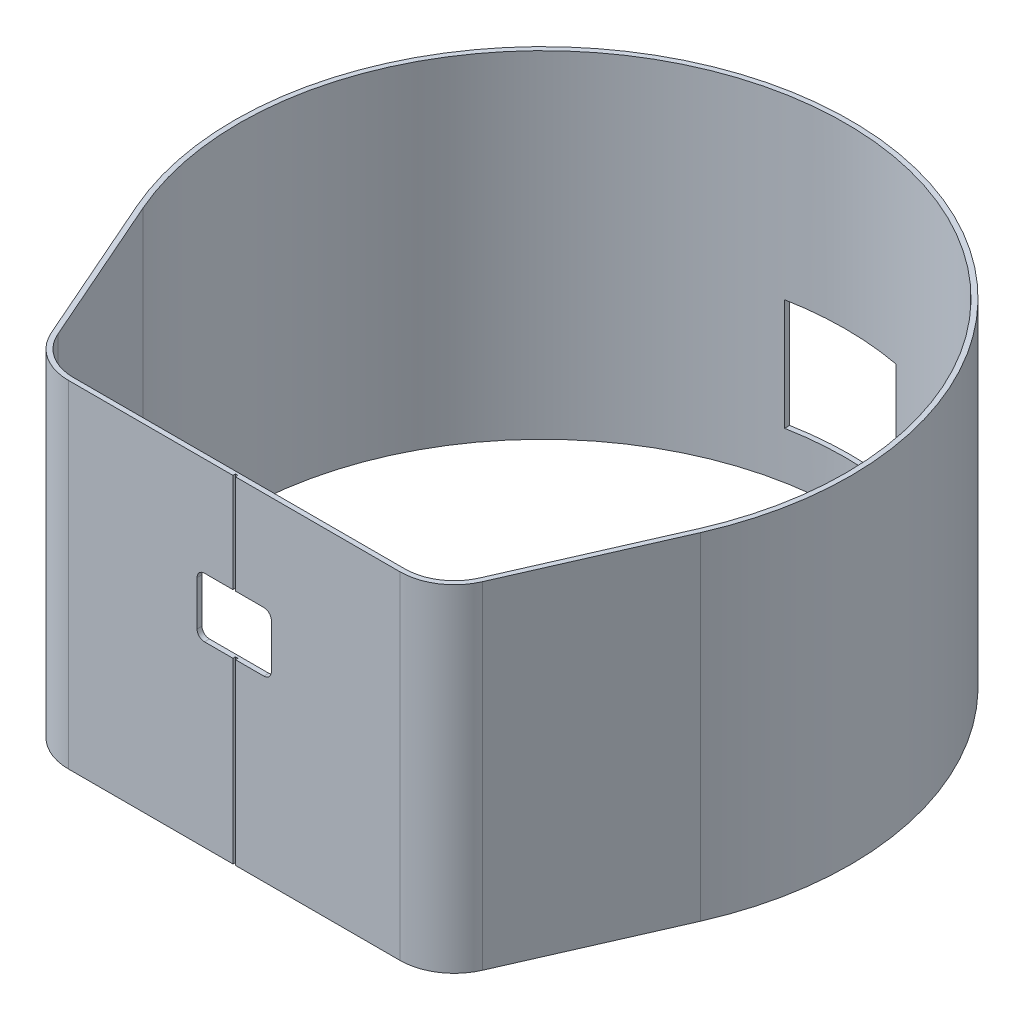
ISO-10303-21;
HEADER;
FILE_DESCRIPTION(('STEP AP214'),'2;1');
FILE_NAME('part.step','',(''),(''),'','','');
FILE_SCHEMA(('AUTOMOTIVE_DESIGN { 1 0 10303 214 1 1 1 1 }'));
ENDSEC;
DATA;
#1=APPLICATION_CONTEXT('core data for automotive mechanical design processes');
#2=APPLICATION_PROTOCOL_DEFINITION('international standard','automotive_design',2000,#1);
#3=PRODUCT_CONTEXT('',#1,'mechanical');
#4=PRODUCT('Part','Part','',(#3));
#5=PRODUCT_RELATED_PRODUCT_CATEGORY('part','',(#4));
#6=PRODUCT_DEFINITION_FORMATION('','',#4);
#7=PRODUCT_DEFINITION_CONTEXT('part definition',#1,'design');
#8=PRODUCT_DEFINITION('design','',#6,#7);
#9=PRODUCT_DEFINITION_SHAPE('','',#8);
#10=(LENGTH_UNIT() NAMED_UNIT(*) SI_UNIT(.MILLI.,.METRE.));
#11=(NAMED_UNIT(*) PLANE_ANGLE_UNIT() SI_UNIT($,.RADIAN.));
#12=(NAMED_UNIT(*) SI_UNIT($,.STERADIAN.) SOLID_ANGLE_UNIT());
#13=UNCERTAINTY_MEASURE_WITH_UNIT(LENGTH_MEASURE(1.E-05),#10,'distance_accuracy_value','');
#14=(GEOMETRIC_REPRESENTATION_CONTEXT(3) GLOBAL_UNCERTAINTY_ASSIGNED_CONTEXT((#13)) GLOBAL_UNIT_ASSIGNED_CONTEXT((#10,
#11,#12)) REPRESENTATION_CONTEXT('',''));
#15=CARTESIAN_POINT('',(0.,0.,0.));
#16=DIRECTION('',(0.,0.,1.));
#17=DIRECTION('',(1.,0.,0.));
#18=AXIS2_PLACEMENT_3D('',#15,#16,#17);
#19=CARTESIAN_POINT('',(0.,90.,62.25));
#20=DIRECTION('',(0.,0.,-1.));
#21=DIRECTION('',(-1.,0.,0.));
#22=AXIS2_PLACEMENT_3D('',#19,#20,#21);
#23=PLANE('',#22);
#24=DIRECTION('',(1.,0.,0.));
#25=VECTOR('',#24,1.);
#26=CARTESIAN_POINT('',(0.,90.,62.25));
#27=LINE('',#26,#25);
#28=CARTESIAN_POINT('',(0.249999999999986,90.,62.25));
#29=VERTEX_POINT('',#28);
#30=CARTESIAN_POINT('',(33.4693877551021,90.,62.25));
#31=VERTEX_POINT('',#30);
#32=EDGE_CURVE('E406',#29,#31,#27,.T.);
#33=ORIENTED_EDGE('',*,*,#32,.F.);
#34=DIRECTION('',(0.,1.,0.));
#35=VECTOR('',#34,1.);
#36=CARTESIAN_POINT('',(0.249999999999986,90.,62.25));
#37=LINE('',#36,#35);
#38=CARTESIAN_POINT('',(0.249999999999984,70.,62.25));
#39=VERTEX_POINT('',#38);
#40=EDGE_CURVE('E515',#39,#29,#37,.T.);
#41=ORIENTED_EDGE('',*,*,#40,.F.);
#42=DIRECTION('',(-1.,0.,0.));
#43=VECTOR('',#42,1.);
#44=CARTESIAN_POINT('',(-5.99999999999999,70.,62.25));
#45=LINE('',#44,#43);
#46=CARTESIAN_POINT('',(5.99999999999999,70.,62.25));
#47=VERTEX_POINT('',#46);
#48=EDGE_CURVE('E287',#47,#39,#45,.T.);
#49=ORIENTED_EDGE('',*,*,#48,.F.);
#50=CARTESIAN_POINT('',(6.,68.5,62.25));
#51=DIRECTION('',(0.,0.,1.));
#52=DIRECTION('',(1.,0.,0.));
#53=AXIS2_PLACEMENT_3D('',#50,#51,#52);
#54=CIRCLE('',#53,1.5);
#55=CARTESIAN_POINT('',(7.5,68.5,62.25));
#56=VERTEX_POINT('',#55);
#57=EDGE_CURVE('E284',#56,#47,#54,.T.);
#58=ORIENTED_EDGE('',*,*,#57,.F.);
#59=DIRECTION('',(0.,1.,0.));
#60=VECTOR('',#59,1.);
#61=CARTESIAN_POINT('',(7.5,59.5,62.25));
#62=LINE('',#61,#60);
#63=CARTESIAN_POINT('',(7.5,59.5,62.25));
#64=VERTEX_POINT('',#63);
#65=EDGE_CURVE('E306',#64,#56,#62,.T.);
#66=ORIENTED_EDGE('',*,*,#65,.F.);
#67=CARTESIAN_POINT('',(6.,59.5,62.25));
#68=DIRECTION('',(0.,0.,1.));
#69=DIRECTION('',(1.,0.,0.));
#70=AXIS2_PLACEMENT_3D('',#67,#68,#69);
#71=CIRCLE('',#70,1.5);
#72=CARTESIAN_POINT('',(5.99999999999999,58.,62.25));
#73=VERTEX_POINT('',#72);
#74=EDGE_CURVE('E303',#73,#64,#71,.T.);
#75=ORIENTED_EDGE('',*,*,#74,.F.);
#76=DIRECTION('',(1.,0.,0.));
#77=VECTOR('',#76,1.);
#78=CARTESIAN_POINT('',(-5.99999999999999,58.,62.25));
#79=LINE('',#78,#77);
#80=CARTESIAN_POINT('',(0.249999999999983,58.,62.25));
#81=VERTEX_POINT('',#80);
#82=EDGE_CURVE('E299',#81,#73,#79,.T.);
#83=ORIENTED_EDGE('',*,*,#82,.F.);
#84=CARTESIAN_POINT('',(0.249999999999979,22.,62.25));
#85=VERTEX_POINT('',#84);
#86=EDGE_CURVE('E259',#85,#81,#37,.T.);
#87=ORIENTED_EDGE('',*,*,#86,.F.);
#88=DIRECTION('',(-1.,0.,0.));
#89=VECTOR('',#88,1.);
#90=CARTESIAN_POINT('',(0.,22.,62.25));
#91=LINE('',#90,#89);
#92=CARTESIAN_POINT('',(33.4693877551021,22.,62.25));
#93=VERTEX_POINT('',#92);
#94=EDGE_CURVE('E350',#93,#85,#91,.T.);
#95=ORIENTED_EDGE('',*,*,#94,.F.);
#96=DIRECTION('',(0.,-1.,0.));
#97=VECTOR('',#96,1.);
#98=CARTESIAN_POINT('',(33.4693877551021,90.,62.25));
#99=LINE('',#98,#97);
#100=EDGE_CURVE('E414',#31,#93,#99,.T.);
#101=ORIENTED_EDGE('',*,*,#100,.F.);
#102=EDGE_LOOP('',(#33,#41,#49,#58,#66,#75,#83,#87,#95,#101));
#103=FACE_BOUND('',#102,.T.);
#104=ADVANCED_FACE('F35',(#103),#23,.F.);
#105=CARTESIAN_POINT('',(56.9973722627737,90.,25.0272262773723));
#106=DIRECTION('',(-0.915620437956204,0.,-0.402043795620438));
#107=DIRECTION('',(-0.402043795620438,0.,0.915620437956204));
#108=AXIS2_PLACEMENT_3D('',#105,#106,#107);
#109=PLANE('',#108);
#110=DIRECTION('',(-0.402043795620438,0.,0.915620437956204));
#111=VECTOR('',#110,1.);
#112=CARTESIAN_POINT('',(56.9973722627737,22.,25.0272262773723));
#113=LINE('',#112,#111);
#114=CARTESIAN_POINT('',(56.9973722627737,22.,25.0272262773725));
#115=VERTEX_POINT('',#114);
#116=CARTESIAN_POINT('',(43.5412125726203,22.,55.6724817518248));
#117=VERTEX_POINT('',#116);
#118=EDGE_CURVE('E358',#115,#117,#113,.T.);
#119=ORIENTED_EDGE('',*,*,#118,.F.);
#120=DIRECTION('',(0.,-1.,0.));
#121=VECTOR('',#120,1.);
#122=CARTESIAN_POINT('',(56.9973722627737,90.,25.0272262773725));
#123=LINE('',#122,#121);
#124=CARTESIAN_POINT('',(56.9973722627737,90.,25.0272262773725));
#125=VERTEX_POINT('',#124);
#126=EDGE_CURVE('E427',#125,#115,#123,.T.);
#127=ORIENTED_EDGE('',*,*,#126,.F.);
#128=DIRECTION('',(0.402043795620438,0.,-0.915620437956204));
#129=VECTOR('',#128,1.);
#130=CARTESIAN_POINT('',(56.9973722627737,90.,25.0272262773723));
#131=LINE('',#130,#129);
#132=CARTESIAN_POINT('',(43.5412125726203,90.,55.6724817518248));
#133=VERTEX_POINT('',#132);
#134=EDGE_CURVE('E396',#133,#125,#131,.T.);
#135=ORIENTED_EDGE('',*,*,#134,.F.);
#136=DIRECTION('',(0.,-1.,0.));
#137=VECTOR('',#136,1.);
#138=CARTESIAN_POINT('',(43.5412125726203,90.,55.6724817518248));
#139=LINE('',#138,#137);
#140=EDGE_CURVE('E411',#133,#117,#139,.T.);
#141=ORIENTED_EDGE('',*,*,#140,.T.);
#142=EDGE_LOOP('',(#119,#127,#135,#141));
#143=FACE_BOUND('',#142,.T.);
#144=ADVANCED_FACE('F541',(#143),#109,.F.);
#145=CARTESIAN_POINT('',(0.,90.,0.));
#146=DIRECTION('',(0.,-1.,0.));
#147=DIRECTION('',(0.,0.,-1.));
#148=AXIS2_PLACEMENT_3D('',#145,#146,#147);
#149=CYLINDRICAL_SURFACE('',#148,62.25);
#150=DIRECTION('',(0.,-1.,0.));
#151=VECTOR('',#150,1.);
#152=CARTESIAN_POINT('',(11.25,90.,-61.2249948958757));
#153=LINE('',#152,#151);
#154=CARTESIAN_POINT('',(11.25,31.5,-61.2249948958757));
#155=VERTEX_POINT('',#154);
#156=CARTESIAN_POINT('',(11.25,54.,-61.2249948958757));
#157=VERTEX_POINT('',#156);
#158=EDGE_CURVE('E341',#155,#157,#153,.F.);
#159=ORIENTED_EDGE('',*,*,#158,.T.);
#160=CARTESIAN_POINT('',(0.,54.,0.));
#161=DIRECTION('',(0.,1.,0.));
#162=DIRECTION('',(0.,0.,1.));
#163=AXIS2_PLACEMENT_3D('',#160,#161,#162);
#164=CIRCLE('',#163,62.25);
#165=CARTESIAN_POINT('',(-11.25,54.,-61.2249948958757));
#166=VERTEX_POINT('',#165);
#167=EDGE_CURVE('E344',#157,#166,#164,.T.);
#168=ORIENTED_EDGE('',*,*,#167,.T.);
#169=DIRECTION('',(0.,-1.,0.));
#170=VECTOR('',#169,1.);
#171=CARTESIAN_POINT('',(-11.25,90.,-61.2249948958757));
#172=LINE('',#171,#170);
#173=CARTESIAN_POINT('',(-11.25,31.5,-61.2249948958757));
#174=VERTEX_POINT('',#173);
#175=EDGE_CURVE('E346',#166,#174,#172,.T.);
#176=ORIENTED_EDGE('',*,*,#175,.T.);
#177=CARTESIAN_POINT('',(0.,31.5,0.));
#178=DIRECTION('',(0.,-1.,0.));
#179=DIRECTION('',(0.,0.,-1.));
#180=AXIS2_PLACEMENT_3D('',#177,#178,#179);
#181=CIRCLE('',#180,62.25);
#182=EDGE_CURVE('E332',#174,#155,#181,.T.);
#183=ORIENTED_EDGE('',*,*,#182,.T.);
#184=EDGE_LOOP('',(#159,#168,#176,#183));
#185=FACE_BOUND('',#184,.T.);
#186=CARTESIAN_POINT('',(0.,22.,0.));
#187=DIRECTION('',(0.,-1.,0.));
#188=DIRECTION('',(0.,0.,-1.));
#189=AXIS2_PLACEMENT_3D('',#186,#187,#188);
#190=CIRCLE('',#189,62.25);
#191=CARTESIAN_POINT('',(-56.9973722627736,22.,25.0272262773725));
#192=VERTEX_POINT('',#191);
#193=EDGE_CURVE('E359',#192,#115,#190,.T.);
#194=ORIENTED_EDGE('',*,*,#193,.F.);
#195=DIRECTION('',(0.,-1.,0.));
#196=VECTOR('',#195,1.);
#197=CARTESIAN_POINT('',(-56.9973722627736,90.,25.0272262773725));
#198=LINE('',#197,#196);
#199=CARTESIAN_POINT('',(-56.9973722627736,90.,25.0272262773725));
#200=VERTEX_POINT('',#199);
#201=EDGE_CURVE('E424',#200,#192,#198,.T.);
#202=ORIENTED_EDGE('',*,*,#201,.F.);
#203=CARTESIAN_POINT('',(0.,90.,0.));
#204=DIRECTION('',(0.,1.,0.));
#205=DIRECTION('',(0.,0.,1.));
#206=AXIS2_PLACEMENT_3D('',#203,#204,#205);
#207=CIRCLE('',#206,62.25);
#208=EDGE_CURVE('E399',#125,#200,#207,.T.);
#209=ORIENTED_EDGE('',*,*,#208,.F.);
#210=ORIENTED_EDGE('',*,*,#126,.T.);
#211=EDGE_LOOP('',(#194,#202,#209,#210));
#212=FACE_BOUND('',#211,.T.);
#213=ADVANCED_FACE('F546',(#185,#212),#149,.T.);
#214=CARTESIAN_POINT('',(-56.9973722627737,90.,25.0272262773723));
#215=DIRECTION('',(-0.915620437956205,0.,0.402043795620438));
#216=DIRECTION('',(0.402043795620438,0.,0.915620437956205));
#217=AXIS2_PLACEMENT_3D('',#214,#215,#216);
#218=PLANE('',#217);
#219=ORIENTED_EDGE('',*,*,#201,.T.);
#220=DIRECTION('',(0.402043795620438,0.,0.915620437956205));
#221=VECTOR('',#220,1.);
#222=CARTESIAN_POINT('',(-56.9973722627737,22.,25.0272262773723));
#223=LINE('',#222,#221);
#224=CARTESIAN_POINT('',(-43.5412125726203,22.,55.6724817518248));
#225=VERTEX_POINT('',#224);
#226=EDGE_CURVE('E355',#192,#225,#223,.T.);
#227=ORIENTED_EDGE('',*,*,#226,.T.);
#228=DIRECTION('',(0.,-1.,0.));
#229=VECTOR('',#228,1.);
#230=CARTESIAN_POINT('',(-43.5412125726203,90.,55.6724817518248));
#231=LINE('',#230,#229);
#232=CARTESIAN_POINT('',(-43.5412125726203,90.,55.6724817518248));
#233=VERTEX_POINT('',#232);
#234=EDGE_CURVE('E421',#233,#225,#231,.T.);
#235=ORIENTED_EDGE('',*,*,#234,.F.);
#236=DIRECTION('',(-0.402043795620438,0.,-0.915620437956205));
#237=VECTOR('',#236,1.);
#238=CARTESIAN_POINT('',(-56.9973722627737,90.,25.0272262773723));
#239=LINE('',#238,#237);
#240=EDGE_CURVE('E401',#233,#200,#239,.T.);
#241=ORIENTED_EDGE('',*,*,#240,.T.);
#242=EDGE_LOOP('',(#219,#227,#235,#241));
#243=FACE_BOUND('',#242,.T.);
#244=ADVANCED_FACE('F549',(#243),#218,.T.);
#245=CARTESIAN_POINT('',(-33.4693877551021,90.,51.25));
#246=DIRECTION('',(0.,-1.,0.));
#247=DIRECTION('',(0.,0.,-1.));
#248=AXIS2_PLACEMENT_3D('',#245,#246,#247);
#249=CYLINDRICAL_SURFACE('',#248,11.);
#250=CARTESIAN_POINT('',(-33.4693877551021,22.,51.25));
#251=DIRECTION('',(0.,-1.,0.));
#252=DIRECTION('',(0.,0.,-1.));
#253=AXIS2_PLACEMENT_3D('',#250,#251,#252);
#254=CIRCLE('',#253,11.);
#255=CARTESIAN_POINT('',(-33.4693877551021,22.,62.25));
#256=VERTEX_POINT('',#255);
#257=EDGE_CURVE('E353',#256,#225,#254,.T.);
#258=ORIENTED_EDGE('',*,*,#257,.F.);
#259=DIRECTION('',(0.,-1.,0.));
#260=VECTOR('',#259,1.);
#261=CARTESIAN_POINT('',(-33.4693877551021,90.,62.25));
#262=LINE('',#261,#260);
#263=CARTESIAN_POINT('',(-33.4693877551021,90.,62.25));
#264=VERTEX_POINT('',#263);
#265=EDGE_CURVE('E418',#264,#256,#262,.T.);
#266=ORIENTED_EDGE('',*,*,#265,.F.);
#267=CARTESIAN_POINT('',(-33.4693877551021,90.,51.25));
#268=DIRECTION('',(0.,1.,0.));
#269=DIRECTION('',(0.,0.,1.));
#270=AXIS2_PLACEMENT_3D('',#267,#268,#269);
#271=CIRCLE('',#270,11.);
#272=EDGE_CURVE('E404',#233,#264,#271,.T.);
#273=ORIENTED_EDGE('',*,*,#272,.F.);
#274=ORIENTED_EDGE('',*,*,#234,.T.);
#275=EDGE_LOOP('',(#258,#266,#273,#274));
#276=FACE_BOUND('',#275,.T.);
#277=ADVANCED_FACE('F554',(#276),#249,.T.);
#278=CARTESIAN_POINT('',(-0.249999999999993,22.,62.25));
#279=VERTEX_POINT('',#278);
#280=EDGE_CURVE('E349',#279,#256,#91,.T.);
#281=ORIENTED_EDGE('',*,*,#280,.F.);
#282=DIRECTION('',(0.,-1.,0.));
#283=VECTOR('',#282,1.);
#284=CARTESIAN_POINT('',(-0.25,90.,62.25));
#285=LINE('',#284,#283);
#286=CARTESIAN_POINT('',(-0.249999999999997,58.,62.25));
#287=VERTEX_POINT('',#286);
#288=EDGE_CURVE('E521',#287,#279,#285,.T.);
#289=ORIENTED_EDGE('',*,*,#288,.F.);
#290=CARTESIAN_POINT('',(-5.99999999999999,58.,62.25));
#291=VERTEX_POINT('',#290);
#292=EDGE_CURVE('E300',#291,#287,#79,.T.);
#293=ORIENTED_EDGE('',*,*,#292,.F.);
#294=CARTESIAN_POINT('',(-6.,59.5,62.25));
#295=DIRECTION('',(0.,0.,1.));
#296=DIRECTION('',(1.,0.,0.));
#297=AXIS2_PLACEMENT_3D('',#294,#295,#296);
#298=CIRCLE('',#297,1.5);
#299=CARTESIAN_POINT('',(-7.5,59.5,62.25));
#300=VERTEX_POINT('',#299);
#301=EDGE_CURVE('E296',#300,#291,#298,.T.);
#302=ORIENTED_EDGE('',*,*,#301,.F.);
#303=DIRECTION('',(0.,-1.,0.));
#304=VECTOR('',#303,1.);
#305=CARTESIAN_POINT('',(-7.5,59.5,62.25));
#306=LINE('',#305,#304);
#307=CARTESIAN_POINT('',(-7.5,68.5,62.25));
#308=VERTEX_POINT('',#307);
#309=EDGE_CURVE('E293',#308,#300,#306,.T.);
#310=ORIENTED_EDGE('',*,*,#309,.F.);
#311=CARTESIAN_POINT('',(-6.,68.5,62.25));
#312=DIRECTION('',(0.,0.,1.));
#313=DIRECTION('',(-1.,0.,0.));
#314=AXIS2_PLACEMENT_3D('',#311,#312,#313);
#315=CIRCLE('',#314,1.5);
#316=CARTESIAN_POINT('',(-5.99999999999999,70.,62.25));
#317=VERTEX_POINT('',#316);
#318=EDGE_CURVE('E290',#317,#308,#315,.T.);
#319=ORIENTED_EDGE('',*,*,#318,.F.);
#320=CARTESIAN_POINT('',(-0.249999999999998,70.,62.25));
#321=VERTEX_POINT('',#320);
#322=EDGE_CURVE('E286',#321,#317,#45,.T.);
#323=ORIENTED_EDGE('',*,*,#322,.F.);
#324=CARTESIAN_POINT('',(-0.25,90.,62.25));
#325=VERTEX_POINT('',#324);
#326=EDGE_CURVE('E482',#325,#321,#285,.T.);
#327=ORIENTED_EDGE('',*,*,#326,.F.);
#328=EDGE_CURVE('E265',#264,#325,#27,.T.);
#329=ORIENTED_EDGE('',*,*,#328,.F.);
#330=ORIENTED_EDGE('',*,*,#265,.T.);
#331=EDGE_LOOP('',(#281,#289,#293,#302,#310,#319,#323,#327,#329,#330));
#332=FACE_BOUND('',#331,.T.);
#333=ADVANCED_FACE('F481',(#332),#23,.F.);
#334=CARTESIAN_POINT('',(-33.4693877551021,90.,51.25));
#335=DIRECTION('',(0.,-1.,0.));
#336=DIRECTION('',(0.,0.,-1.));
#337=AXIS2_PLACEMENT_3D('',#334,#335,#336);
#338=CYLINDRICAL_SURFACE('',#337,10.);
#339=DIRECTION('',(0.,-1.,0.));
#340=VECTOR('',#339,1.);
#341=CARTESIAN_POINT('',(-33.4693877551021,90.,61.25));
#342=LINE('',#341,#340);
#343=CARTESIAN_POINT('',(-33.4693877551021,90.,61.25));
#344=VERTEX_POINT('',#343);
#345=CARTESIAN_POINT('',(-33.4693877551021,22.,61.25));
#346=VERTEX_POINT('',#345);
#347=EDGE_CURVE('E410',#344,#346,#342,.T.);
#348=ORIENTED_EDGE('',*,*,#347,.T.);
#349=CARTESIAN_POINT('',(-33.4693877551021,22.,51.25));
#350=DIRECTION('',(0.,-1.,0.));
#351=DIRECTION('',(0.,0.,-1.));
#352=AXIS2_PLACEMENT_3D('',#349,#350,#351);
#353=CIRCLE('',#352,10.);
#354=CARTESIAN_POINT('',(-42.6255921346641,22.,55.2704379562044));
#355=VERTEX_POINT('',#354);
#356=EDGE_CURVE('E376',#346,#355,#353,.T.);
#357=ORIENTED_EDGE('',*,*,#356,.T.);
#358=DIRECTION('',(0.,-1.,0.));
#359=VECTOR('',#358,1.);
#360=CARTESIAN_POINT('',(-42.6255921346641,90.,55.2704379562044));
#361=LINE('',#360,#359);
#362=CARTESIAN_POINT('',(-42.6255921346641,90.,55.2704379562044));
#363=VERTEX_POINT('',#362);
#364=EDGE_CURVE('E415',#363,#355,#361,.T.);
#365=ORIENTED_EDGE('',*,*,#364,.F.);
#366=CARTESIAN_POINT('',(-33.4693877551021,90.,51.25));
#367=DIRECTION('',(0.,1.,0.));
#368=DIRECTION('',(0.,0.,1.));
#369=AXIS2_PLACEMENT_3D('',#366,#367,#368);
#370=CIRCLE('',#369,10.);
#371=EDGE_CURVE('E379',#363,#344,#370,.T.);
#372=ORIENTED_EDGE('',*,*,#371,.T.);
#373=EDGE_LOOP('',(#348,#357,#365,#372));
#374=FACE_BOUND('',#373,.T.);
#375=ADVANCED_FACE('F37',(#374),#338,.F.);
#376=CARTESIAN_POINT('',(-56.0817518248175,90.,24.6251824817518));
#377=DIRECTION('',(-0.915620437956205,0.,0.402043795620438));
#378=DIRECTION('',(0.402043795620438,0.,0.915620437956205));
#379=AXIS2_PLACEMENT_3D('',#376,#377,#378);
#380=PLANE('',#379);
#381=DIRECTION('',(0.402043795620438,0.,0.915620437956205));
#382=VECTOR('',#381,1.);
#383=CARTESIAN_POINT('',(-56.0817518248175,22.,24.6251824817518));
#384=LINE('',#383,#382);
#385=CARTESIAN_POINT('',(-56.0817518248174,22.,24.625182481752));
#386=VERTEX_POINT('',#385);
#387=EDGE_CURVE('E374',#386,#355,#384,.T.);
#388=ORIENTED_EDGE('',*,*,#387,.F.);
#389=DIRECTION('',(0.,-1.,0.));
#390=VECTOR('',#389,1.);
#391=CARTESIAN_POINT('',(-56.0817518248174,90.,24.625182481752));
#392=LINE('',#391,#390);
#393=CARTESIAN_POINT('',(-56.0817518248174,90.,24.625182481752));
#394=VERTEX_POINT('',#393);
#395=EDGE_CURVE('E442',#394,#386,#392,.T.);
#396=ORIENTED_EDGE('',*,*,#395,.F.);
#397=DIRECTION('',(-0.402043795620438,0.,-0.915620437956205));
#398=VECTOR('',#397,1.);
#399=CARTESIAN_POINT('',(-56.0817518248175,90.,24.6251824817518));
#400=LINE('',#399,#398);
#401=EDGE_CURVE('E382',#363,#394,#400,.T.);
#402=ORIENTED_EDGE('',*,*,#401,.F.);
#403=ORIENTED_EDGE('',*,*,#364,.T.);
#404=EDGE_LOOP('',(#388,#396,#402,#403));
#405=FACE_BOUND('',#404,.T.);
#406=ADVANCED_FACE('F592',(#405),#380,.F.);
#407=CARTESIAN_POINT('',(0.,90.,0.));
#408=DIRECTION('',(0.,-1.,0.));
#409=DIRECTION('',(0.,0.,-1.));
#410=AXIS2_PLACEMENT_3D('',#407,#408,#409);
#411=CYLINDRICAL_SURFACE('',#410,61.25);
#412=DIRECTION('',(0.,-1.,0.));
#413=VECTOR('',#412,1.);
#414=CARTESIAN_POINT('',(-11.25,90.,-60.2079728939615));
#415=LINE('',#414,#413);
#416=CARTESIAN_POINT('',(-11.25,54.,-60.2079728939615));
#417=VERTEX_POINT('',#416);
#418=CARTESIAN_POINT('',(-11.25,31.5,-60.2079728939615));
#419=VERTEX_POINT('',#418);
#420=EDGE_CURVE('E454',#417,#419,#415,.T.);
#421=ORIENTED_EDGE('',*,*,#420,.F.);
#422=CARTESIAN_POINT('',(0.,54.,0.));
#423=DIRECTION('',(0.,1.,0.));
#424=DIRECTION('',(0.,0.,1.));
#425=AXIS2_PLACEMENT_3D('',#422,#423,#424);
#426=CIRCLE('',#425,61.25);
#427=CARTESIAN_POINT('',(11.25,54.,-60.2079728939615));
#428=VERTEX_POINT('',#427);
#429=EDGE_CURVE('E452',#428,#417,#426,.T.);
#430=ORIENTED_EDGE('',*,*,#429,.F.);
#431=DIRECTION('',(0.,-1.,0.));
#432=VECTOR('',#431,1.);
#433=CARTESIAN_POINT('',(11.25,90.,-60.2079728939615));
#434=LINE('',#433,#432);
#435=CARTESIAN_POINT('',(11.25,31.5,-60.2079728939615));
#436=VERTEX_POINT('',#435);
#437=EDGE_CURVE('E450',#436,#428,#434,.F.);
#438=ORIENTED_EDGE('',*,*,#437,.F.);
#439=CARTESIAN_POINT('',(0.,31.5,0.));
#440=DIRECTION('',(0.,-1.,0.));
#441=DIRECTION('',(0.,0.,-1.));
#442=AXIS2_PLACEMENT_3D('',#439,#440,#441);
#443=CIRCLE('',#442,61.25);
#444=EDGE_CURVE('E448',#419,#436,#443,.T.);
#445=ORIENTED_EDGE('',*,*,#444,.F.);
#446=EDGE_LOOP('',(#421,#430,#438,#445));
#447=FACE_BOUND('',#446,.T.);
#448=ORIENTED_EDGE('',*,*,#395,.T.);
#449=CARTESIAN_POINT('',(0.,22.,0.));
#450=DIRECTION('',(0.,-1.,0.));
#451=DIRECTION('',(0.,0.,-1.));
#452=AXIS2_PLACEMENT_3D('',#449,#450,#451);
#453=CIRCLE('',#452,61.25);
#454=CARTESIAN_POINT('',(56.0817518248174,22.,24.625182481752));
#455=VERTEX_POINT('',#454);
#456=EDGE_CURVE('E371',#386,#455,#453,.T.);
#457=ORIENTED_EDGE('',*,*,#456,.T.);
#458=DIRECTION('',(0.,-1.,0.));
#459=VECTOR('',#458,1.);
#460=CARTESIAN_POINT('',(56.0817518248174,90.,24.625182481752));
#461=LINE('',#460,#459);
#462=CARTESIAN_POINT('',(56.0817518248174,90.,24.625182481752));
#463=VERTEX_POINT('',#462);
#464=EDGE_CURVE('E439',#463,#455,#461,.T.);
#465=ORIENTED_EDGE('',*,*,#464,.F.);
#466=CARTESIAN_POINT('',(0.,90.,0.));
#467=DIRECTION('',(0.,1.,0.));
#468=DIRECTION('',(0.,0.,1.));
#469=AXIS2_PLACEMENT_3D('',#466,#467,#468);
#470=CIRCLE('',#469,61.25);
#471=EDGE_CURVE('E384',#463,#394,#470,.T.);
#472=ORIENTED_EDGE('',*,*,#471,.T.);
#473=EDGE_LOOP('',(#448,#457,#465,#472));
#474=FACE_BOUND('',#473,.T.);
#475=ADVANCED_FACE('F611',(#447,#474),#411,.F.);
#476=CARTESIAN_POINT('',(56.0817518248175,90.,24.6251824817518));
#477=DIRECTION('',(-0.915620437956205,0.,-0.402043795620438));
#478=DIRECTION('',(-0.402043795620438,0.,0.915620437956205));
#479=AXIS2_PLACEMENT_3D('',#476,#477,#478);
#480=PLANE('',#479);
#481=ORIENTED_EDGE('',*,*,#464,.T.);
#482=DIRECTION('',(-0.402043795620438,0.,0.915620437956205));
#483=VECTOR('',#482,1.);
#484=CARTESIAN_POINT('',(56.0817518248175,22.,24.6251824817518));
#485=LINE('',#484,#483);
#486=CARTESIAN_POINT('',(42.6255921346641,22.,55.2704379562044));
#487=VERTEX_POINT('',#486);
#488=EDGE_CURVE('E368',#455,#487,#485,.T.);
#489=ORIENTED_EDGE('',*,*,#488,.T.);
#490=DIRECTION('',(0.,-1.,0.));
#491=VECTOR('',#490,1.);
#492=CARTESIAN_POINT('',(42.6255921346641,90.,55.2704379562044));
#493=LINE('',#492,#491);
#494=CARTESIAN_POINT('',(42.6255921346641,90.,55.2704379562044));
#495=VERTEX_POINT('',#494);
#496=EDGE_CURVE('E436',#495,#487,#493,.T.);
#497=ORIENTED_EDGE('',*,*,#496,.F.);
#498=DIRECTION('',(0.402043795620438,0.,-0.915620437956205));
#499=VECTOR('',#498,1.);
#500=CARTESIAN_POINT('',(56.0817518248175,90.,24.6251824817518));
#501=LINE('',#500,#499);
#502=EDGE_CURVE('E387',#495,#463,#501,.T.);
#503=ORIENTED_EDGE('',*,*,#502,.T.);
#504=EDGE_LOOP('',(#481,#489,#497,#503));
#505=FACE_BOUND('',#504,.T.);
#506=ADVANCED_FACE('F607',(#505),#480,.T.);
#507=CARTESIAN_POINT('',(33.4693877551021,90.,51.25));
#508=DIRECTION('',(0.,-1.,0.));
#509=DIRECTION('',(0.,0.,-1.));
#510=AXIS2_PLACEMENT_3D('',#507,#508,#509);
#511=CYLINDRICAL_SURFACE('',#510,10.);
#512=ORIENTED_EDGE('',*,*,#496,.T.);
#513=CARTESIAN_POINT('',(33.4693877551021,22.,51.25));
#514=DIRECTION('',(0.,-1.,0.));
#515=DIRECTION('',(0.,0.,-1.));
#516=AXIS2_PLACEMENT_3D('',#513,#514,#515);
#517=CIRCLE('',#516,10.);
#518=CARTESIAN_POINT('',(33.4693877551021,22.,61.25));
#519=VERTEX_POINT('',#518);
#520=EDGE_CURVE('E365',#487,#519,#517,.T.);
#521=ORIENTED_EDGE('',*,*,#520,.T.);
#522=DIRECTION('',(0.,-1.,0.));
#523=VECTOR('',#522,1.);
#524=CARTESIAN_POINT('',(33.4693877551021,90.,61.25));
#525=LINE('',#524,#523);
#526=CARTESIAN_POINT('',(33.4693877551021,90.,61.25));
#527=VERTEX_POINT('',#526);
#528=EDGE_CURVE('E433',#527,#519,#525,.T.);
#529=ORIENTED_EDGE('',*,*,#528,.F.);
#530=CARTESIAN_POINT('',(33.4693877551021,90.,51.25));
#531=DIRECTION('',(0.,1.,0.));
#532=DIRECTION('',(0.,0.,1.));
#533=AXIS2_PLACEMENT_3D('',#530,#531,#532);
#534=CIRCLE('',#533,10.);
#535=EDGE_CURVE('E390',#527,#495,#534,.T.);
#536=ORIENTED_EDGE('',*,*,#535,.T.);
#537=EDGE_LOOP('',(#512,#521,#529,#536));
#538=FACE_BOUND('',#537,.T.);
#539=ADVANCED_FACE('F604',(#538),#511,.F.);
#540=CARTESIAN_POINT('',(0.,90.,61.25));
#541=DIRECTION('',(0.,0.,-1.));
#542=DIRECTION('',(-1.,0.,0.));
#543=AXIS2_PLACEMENT_3D('',#540,#541,#542);
#544=PLANE('',#543);
#545=CARTESIAN_POINT('',(6.,68.5,61.25));
#546=DIRECTION('',(0.,0.,-1.));
#547=DIRECTION('',(-1.,0.,0.));
#548=AXIS2_PLACEMENT_3D('',#545,#546,#547);
#549=CIRCLE('',#548,1.5);
#550=CARTESIAN_POINT('',(5.99999999999999,70.,61.25));
#551=VERTEX_POINT('',#550);
#552=CARTESIAN_POINT('',(7.5,68.5,61.25));
#553=VERTEX_POINT('',#552);
#554=EDGE_CURVE('E472',#551,#553,#549,.T.);
#555=ORIENTED_EDGE('',*,*,#554,.F.);
#556=DIRECTION('',(1.,0.,0.));
#557=VECTOR('',#556,1.);
#558=CARTESIAN_POINT('',(0.,70.,61.25));
#559=LINE('',#558,#557);
#560=CARTESIAN_POINT('',(-5.99999999999999,70.,61.25));
#561=VERTEX_POINT('',#560);
#562=EDGE_CURVE('E457',#561,#551,#559,.T.);
#563=ORIENTED_EDGE('',*,*,#562,.F.);
#564=CARTESIAN_POINT('',(-6.,68.5,61.25));
#565=DIRECTION('',(0.,0.,-1.));
#566=DIRECTION('',(-1.,0.,0.));
#567=AXIS2_PLACEMENT_3D('',#564,#565,#566);
#568=CIRCLE('',#567,1.5);
#569=CARTESIAN_POINT('',(-7.5,68.5,61.25));
#570=VERTEX_POINT('',#569);
#571=EDGE_CURVE('E459',#570,#561,#568,.T.);
#572=ORIENTED_EDGE('',*,*,#571,.F.);
#573=DIRECTION('',(0.,1.,0.));
#574=VECTOR('',#573,1.);
#575=CARTESIAN_POINT('',(-7.50000000000001,90.,61.25));
#576=LINE('',#575,#574);
#577=CARTESIAN_POINT('',(-7.5,59.5,61.25));
#578=VERTEX_POINT('',#577);
#579=EDGE_CURVE('E462',#578,#570,#576,.T.);
#580=ORIENTED_EDGE('',*,*,#579,.F.);
#581=CARTESIAN_POINT('',(-6.,59.5,61.25));
#582=DIRECTION('',(0.,0.,-1.));
#583=DIRECTION('',(-1.,0.,0.));
#584=AXIS2_PLACEMENT_3D('',#581,#582,#583);
#585=CIRCLE('',#584,1.5);
#586=CARTESIAN_POINT('',(-5.99999999999999,58.,61.25));
#587=VERTEX_POINT('',#586);
#588=EDGE_CURVE('E464',#587,#578,#585,.T.);
#589=ORIENTED_EDGE('',*,*,#588,.F.);
#590=DIRECTION('',(-1.,0.,0.));
#591=VECTOR('',#590,1.);
#592=CARTESIAN_POINT('',(0.,58.,61.25));
#593=LINE('',#592,#591);
#594=CARTESIAN_POINT('',(5.99999999999999,58.,61.25));
#595=VERTEX_POINT('',#594);
#596=EDGE_CURVE('E466',#595,#587,#593,.T.);
#597=ORIENTED_EDGE('',*,*,#596,.F.);
#598=CARTESIAN_POINT('',(6.,59.5,61.25));
#599=DIRECTION('',(0.,0.,-1.));
#600=DIRECTION('',(-1.,0.,0.));
#601=AXIS2_PLACEMENT_3D('',#598,#599,#600);
#602=CIRCLE('',#601,1.5);
#603=CARTESIAN_POINT('',(7.5,59.5,61.25));
#604=VERTEX_POINT('',#603);
#605=EDGE_CURVE('E468',#604,#595,#602,.T.);
#606=ORIENTED_EDGE('',*,*,#605,.F.);
#607=DIRECTION('',(0.,-1.,0.));
#608=VECTOR('',#607,1.);
#609=CARTESIAN_POINT('',(7.49999999999999,90.,61.25));
#610=LINE('',#609,#608);
#611=EDGE_CURVE('E470',#553,#604,#610,.T.);
#612=ORIENTED_EDGE('',*,*,#611,.F.);
#613=EDGE_LOOP('',(#555,#563,#572,#580,#589,#597,#606,#612));
#614=FACE_BOUND('',#613,.T.);
#615=ORIENTED_EDGE('',*,*,#528,.T.);
#616=DIRECTION('',(-1.,0.,0.));
#617=VECTOR('',#616,1.);
#618=CARTESIAN_POINT('',(0.,22.,61.25));
#619=LINE('',#618,#617);
#620=EDGE_CURVE('E361',#519,#346,#619,.T.);
#621=ORIENTED_EDGE('',*,*,#620,.T.);
#622=ORIENTED_EDGE('',*,*,#347,.F.);
#623=DIRECTION('',(1.,0.,0.));
#624=VECTOR('',#623,1.);
#625=CARTESIAN_POINT('',(0.,90.,61.25));
#626=LINE('',#625,#624);
#627=EDGE_CURVE('E393',#344,#527,#626,.T.);
#628=ORIENTED_EDGE('',*,*,#627,.T.);
#629=EDGE_LOOP('',(#615,#621,#622,#628));
#630=FACE_BOUND('',#629,.T.);
#631=ADVANCED_FACE('F499',(#614,#630),#544,.T.);
#632=CARTESIAN_POINT('',(33.4693877551021,90.,51.25));
#633=DIRECTION('',(0.,-1.,0.));
#634=DIRECTION('',(0.,0.,-1.));
#635=AXIS2_PLACEMENT_3D('',#632,#633,#634);
#636=CYLINDRICAL_SURFACE('',#635,11.);
#637=CARTESIAN_POINT('',(33.4693877551021,22.,51.25));
#638=DIRECTION('',(0.,-1.,0.));
#639=DIRECTION('',(0.,0.,-1.));
#640=AXIS2_PLACEMENT_3D('',#637,#638,#639);
#641=CIRCLE('',#640,11.);
#642=EDGE_CURVE('E430',#117,#93,#641,.T.);
#643=ORIENTED_EDGE('',*,*,#642,.F.);
#644=ORIENTED_EDGE('',*,*,#140,.F.);
#645=CARTESIAN_POINT('',(33.4693877551021,90.,51.25));
#646=DIRECTION('',(0.,1.,0.));
#647=DIRECTION('',(0.,0.,1.));
#648=AXIS2_PLACEMENT_3D('',#645,#646,#647);
#649=CIRCLE('',#648,11.);
#650=EDGE_CURVE('E408',#31,#133,#649,.T.);
#651=ORIENTED_EDGE('',*,*,#650,.F.);
#652=ORIENTED_EDGE('',*,*,#100,.T.);
#653=EDGE_LOOP('',(#643,#644,#651,#652));
#654=FACE_BOUND('',#653,.T.);
#655=ADVANCED_FACE('F537',(#654),#636,.T.);
#656=CARTESIAN_POINT('',(0.,90.,0.));
#657=DIRECTION('',(0.,1.,0.));
#658=DIRECTION('',(0.,0.,1.));
#659=AXIS2_PLACEMENT_3D('',#656,#657,#658);
#660=PLANE('',#659);
#661=DIRECTION('',(0.,0.,1.));
#662=VECTOR('',#661,1.);
#663=CARTESIAN_POINT('',(0.249999999999986,90.,61.75));
#664=LINE('',#663,#662);
#665=CARTESIAN_POINT('',(0.249999999999986,90.,61.75));
#666=VERTEX_POINT('',#665);
#667=EDGE_CURVE('E278',#666,#29,#664,.T.);
#668=ORIENTED_EDGE('',*,*,#667,.T.);
#669=ORIENTED_EDGE('',*,*,#32,.T.);
#670=ORIENTED_EDGE('',*,*,#650,.T.);
#671=ORIENTED_EDGE('',*,*,#134,.T.);
#672=ORIENTED_EDGE('',*,*,#208,.T.);
#673=ORIENTED_EDGE('',*,*,#240,.F.);
#674=ORIENTED_EDGE('',*,*,#272,.T.);
#675=ORIENTED_EDGE('',*,*,#328,.T.);
#676=DIRECTION('',(0.,0.,1.));
#677=VECTOR('',#676,1.);
#678=CARTESIAN_POINT('',(-0.25,90.,61.75));
#679=LINE('',#678,#677);
#680=CARTESIAN_POINT('',(-0.25,90.,61.75));
#681=VERTEX_POINT('',#680);
#682=EDGE_CURVE('E244',#681,#325,#679,.T.);
#683=ORIENTED_EDGE('',*,*,#682,.F.);
#684=DIRECTION('',(-1.,0.,0.));
#685=VECTOR('',#684,1.);
#686=CARTESIAN_POINT('',(-0.25,90.,61.75));
#687=LINE('',#686,#685);
#688=EDGE_CURVE('E252',#666,#681,#687,.T.);
#689=ORIENTED_EDGE('',*,*,#688,.F.);
#690=EDGE_LOOP('',(#668,#669,#670,#671,#672,#673,#674,#675,#683,#689));
#691=FACE_BOUND('',#690,.T.);
#692=ORIENTED_EDGE('',*,*,#371,.F.);
#693=ORIENTED_EDGE('',*,*,#401,.T.);
#694=ORIENTED_EDGE('',*,*,#471,.F.);
#695=ORIENTED_EDGE('',*,*,#502,.F.);
#696=ORIENTED_EDGE('',*,*,#535,.F.);
#697=ORIENTED_EDGE('',*,*,#627,.F.);
#698=EDGE_LOOP('',(#692,#693,#694,#695,#696,#697));
#699=FACE_BOUND('',#698,.T.);
#700=ADVANCED_FACE('F262',(#691,#699),#660,.T.);
#701=CARTESIAN_POINT('',(-62.25,22.,0.));
#702=DIRECTION('',(0.,-1.,0.));
#703=DIRECTION('',(0.,0.,-1.));
#704=AXIS2_PLACEMENT_3D('',#701,#702,#703);
#705=PLANE('',#704);
#706=DIRECTION('',(0.,0.,1.));
#707=VECTOR('',#706,1.);
#708=CARTESIAN_POINT('',(0.249999999999979,22.,61.75));
#709=LINE('',#708,#707);
#710=CARTESIAN_POINT('',(0.249999999999979,22.,61.75));
#711=VERTEX_POINT('',#710);
#712=EDGE_CURVE('E269',#711,#85,#709,.T.);
#713=ORIENTED_EDGE('',*,*,#712,.F.);
#714=DIRECTION('',(1.,0.,0.));
#715=VECTOR('',#714,1.);
#716=CARTESIAN_POINT('',(-0.249999999999993,22.,61.75));
#717=LINE('',#716,#715);
#718=CARTESIAN_POINT('',(-0.249999999999993,22.,61.75));
#719=VERTEX_POINT('',#718);
#720=EDGE_CURVE('E248',#719,#711,#717,.T.);
#721=ORIENTED_EDGE('',*,*,#720,.F.);
#722=DIRECTION('',(0.,0.,1.));
#723=VECTOR('',#722,1.);
#724=CARTESIAN_POINT('',(-0.249999999999993,22.,61.75));
#725=LINE('',#724,#723);
#726=EDGE_CURVE('E266',#719,#279,#725,.T.);
#727=ORIENTED_EDGE('',*,*,#726,.T.);
#728=ORIENTED_EDGE('',*,*,#280,.T.);
#729=ORIENTED_EDGE('',*,*,#257,.T.);
#730=ORIENTED_EDGE('',*,*,#226,.F.);
#731=ORIENTED_EDGE('',*,*,#193,.T.);
#732=ORIENTED_EDGE('',*,*,#118,.T.);
#733=ORIENTED_EDGE('',*,*,#642,.T.);
#734=ORIENTED_EDGE('',*,*,#94,.T.);
#735=EDGE_LOOP('',(#713,#721,#727,#728,#729,#730,#731,#732,#733,#734));
#736=FACE_BOUND('',#735,.T.);
#737=ORIENTED_EDGE('',*,*,#620,.F.);
#738=ORIENTED_EDGE('',*,*,#520,.F.);
#739=ORIENTED_EDGE('',*,*,#488,.F.);
#740=ORIENTED_EDGE('',*,*,#456,.F.);
#741=ORIENTED_EDGE('',*,*,#387,.T.);
#742=ORIENTED_EDGE('',*,*,#356,.F.);
#743=EDGE_LOOP('',(#737,#738,#739,#740,#741,#742));
#744=FACE_BOUND('',#743,.T.);
#745=ADVANCED_FACE('F531',(#736,#744),#705,.T.);
#746=CARTESIAN_POINT('',(-11.25,31.5,-62.25));
#747=DIRECTION('',(-1.,0.,0.));
#748=DIRECTION('',(0.,0.,1.));
#749=AXIS2_PLACEMENT_3D('',#746,#747,#748);
#750=PLANE('',#749);
#751=DIRECTION('',(0.,0.,1.));
#752=VECTOR('',#751,1.);
#753=CARTESIAN_POINT('',(-11.25,54.,-62.25));
#754=LINE('',#753,#752);
#755=EDGE_CURVE('E329',#166,#417,#754,.T.);
#756=ORIENTED_EDGE('',*,*,#755,.T.);
#757=ORIENTED_EDGE('',*,*,#420,.T.);
#758=DIRECTION('',(0.,0.,1.));
#759=VECTOR('',#758,1.);
#760=CARTESIAN_POINT('',(-11.25,31.5,-62.25));
#761=LINE('',#760,#759);
#762=EDGE_CURVE('E312',#174,#419,#761,.T.);
#763=ORIENTED_EDGE('',*,*,#762,.F.);
#764=ORIENTED_EDGE('',*,*,#175,.F.);
#765=EDGE_LOOP('',(#756,#757,#763,#764));
#766=FACE_BOUND('',#765,.T.);
#767=ADVANCED_FACE('F629',(#766),#750,.F.);
#768=CARTESIAN_POINT('',(11.25,54.,-62.25));
#769=DIRECTION('',(0.,1.,0.));
#770=DIRECTION('',(0.,0.,1.));
#771=AXIS2_PLACEMENT_3D('',#768,#769,#770);
#772=PLANE('',#771);
#773=DIRECTION('',(0.,0.,1.));
#774=VECTOR('',#773,1.);
#775=CARTESIAN_POINT('',(11.25,54.,-62.25));
#776=LINE('',#775,#774);
#777=EDGE_CURVE('E333',#157,#428,#776,.T.);
#778=ORIENTED_EDGE('',*,*,#777,.T.);
#779=ORIENTED_EDGE('',*,*,#429,.T.);
#780=ORIENTED_EDGE('',*,*,#755,.F.);
#781=ORIENTED_EDGE('',*,*,#167,.F.);
#782=EDGE_LOOP('',(#778,#779,#780,#781));
#783=FACE_BOUND('',#782,.T.);
#784=ADVANCED_FACE('F635',(#783),#772,.F.);
#785=CARTESIAN_POINT('',(11.25,31.5,-62.25));
#786=DIRECTION('',(1.,0.,0.));
#787=DIRECTION('',(0.,0.,-1.));
#788=AXIS2_PLACEMENT_3D('',#785,#786,#787);
#789=PLANE('',#788);
#790=DIRECTION('',(0.,0.,1.));
#791=VECTOR('',#790,1.);
#792=CARTESIAN_POINT('',(11.25,31.5,-62.25));
#793=LINE('',#792,#791);
#794=EDGE_CURVE('E336',#155,#436,#793,.T.);
#795=ORIENTED_EDGE('',*,*,#794,.T.);
#796=ORIENTED_EDGE('',*,*,#437,.T.);
#797=ORIENTED_EDGE('',*,*,#777,.F.);
#798=ORIENTED_EDGE('',*,*,#158,.F.);
#799=EDGE_LOOP('',(#795,#796,#797,#798));
#800=FACE_BOUND('',#799,.T.);
#801=ADVANCED_FACE('F752',(#800),#789,.F.);
#802=CARTESIAN_POINT('',(11.25,31.5,-62.25));
#803=DIRECTION('',(0.,-1.,0.));
#804=DIRECTION('',(0.,0.,-1.));
#805=AXIS2_PLACEMENT_3D('',#802,#803,#804);
#806=PLANE('',#805);
#807=ORIENTED_EDGE('',*,*,#182,.F.);
#808=ORIENTED_EDGE('',*,*,#762,.T.);
#809=ORIENTED_EDGE('',*,*,#444,.T.);
#810=ORIENTED_EDGE('',*,*,#794,.F.);
#811=EDGE_LOOP('',(#807,#808,#809,#810));
#812=FACE_BOUND('',#811,.T.);
#813=ADVANCED_FACE('F745',(#812),#806,.F.);
#814=CARTESIAN_POINT('',(6.,68.5,59.25));
#815=DIRECTION('',(0.,0.,1.));
#816=DIRECTION('',(1.,0.,0.));
#817=AXIS2_PLACEMENT_3D('',#814,#815,#816);
#818=CYLINDRICAL_SURFACE('',#817,1.5);
#819=ORIENTED_EDGE('',*,*,#554,.T.);
#820=DIRECTION('',(0.,0.,1.));
#821=VECTOR('',#820,1.);
#822=CARTESIAN_POINT('',(7.5,68.5,59.25));
#823=LINE('',#822,#821);
#824=EDGE_CURVE('E310',#553,#56,#823,.T.);
#825=ORIENTED_EDGE('',*,*,#824,.T.);
#826=ORIENTED_EDGE('',*,*,#57,.T.);
#827=DIRECTION('',(0.,0.,1.));
#828=VECTOR('',#827,1.);
#829=CARTESIAN_POINT('',(5.99999999999999,70.,59.25));
#830=LINE('',#829,#828);
#831=EDGE_CURVE('E309',#551,#47,#830,.T.);
#832=ORIENTED_EDGE('',*,*,#831,.F.);
#833=EDGE_LOOP('',(#819,#825,#826,#832));
#834=FACE_BOUND('',#833,.T.);
#835=ADVANCED_FACE('F495',(#834),#818,.F.);
#836=CARTESIAN_POINT('',(7.5,59.5,59.25));
#837=DIRECTION('',(1.,0.,0.));
#838=DIRECTION('',(0.,1.,0.));
#839=AXIS2_PLACEMENT_3D('',#836,#837,#838);
#840=PLANE('',#839);
#841=ORIENTED_EDGE('',*,*,#611,.T.);
#842=DIRECTION('',(0.,0.,1.));
#843=VECTOR('',#842,1.);
#844=CARTESIAN_POINT('',(7.5,59.5,59.25));
#845=LINE('',#844,#843);
#846=EDGE_CURVE('E313',#604,#64,#845,.T.);
#847=ORIENTED_EDGE('',*,*,#846,.T.);
#848=ORIENTED_EDGE('',*,*,#65,.T.);
#849=ORIENTED_EDGE('',*,*,#824,.F.);
#850=EDGE_LOOP('',(#841,#847,#848,#849));
#851=FACE_BOUND('',#850,.T.);
#852=ADVANCED_FACE('F505',(#851),#840,.F.);
#853=CARTESIAN_POINT('',(6.,59.5,59.25));
#854=DIRECTION('',(0.,0.,1.));
#855=DIRECTION('',(1.,0.,0.));
#856=AXIS2_PLACEMENT_3D('',#853,#854,#855);
#857=CYLINDRICAL_SURFACE('',#856,1.5);
#858=ORIENTED_EDGE('',*,*,#605,.T.);
#859=DIRECTION('',(0.,0.,1.));
#860=VECTOR('',#859,1.);
#861=CARTESIAN_POINT('',(5.99999999999999,58.,59.25));
#862=LINE('',#861,#860);
#863=EDGE_CURVE('E315',#595,#73,#862,.T.);
#864=ORIENTED_EDGE('',*,*,#863,.T.);
#865=ORIENTED_EDGE('',*,*,#74,.T.);
#866=ORIENTED_EDGE('',*,*,#846,.F.);
#867=EDGE_LOOP('',(#858,#864,#865,#866));
#868=FACE_BOUND('',#867,.T.);
#869=ADVANCED_FACE('F507',(#868),#857,.F.);
#870=CARTESIAN_POINT('',(-5.99999999999999,58.,59.25));
#871=DIRECTION('',(0.,-1.,0.));
#872=DIRECTION('',(0.,0.,-1.));
#873=AXIS2_PLACEMENT_3D('',#870,#871,#872);
#874=PLANE('',#873);
#875=DIRECTION('',(1.,0.,0.));
#876=VECTOR('',#875,1.);
#877=CARTESIAN_POINT('',(-5.99999999999999,58.,61.75));
#878=LINE('',#877,#876);
#879=CARTESIAN_POINT('',(-0.249999999999997,58.,61.75));
#880=VERTEX_POINT('',#879);
#881=CARTESIAN_POINT('',(0.249999999999986,58.,61.75));
#882=VERTEX_POINT('',#881);
#883=EDGE_CURVE('E274',#880,#882,#878,.T.);
#884=ORIENTED_EDGE('',*,*,#883,.T.);
#885=DIRECTION('',(0.,0.,1.));
#886=VECTOR('',#885,1.);
#887=CARTESIAN_POINT('',(0.249999999999983,58.,59.25));
#888=LINE('',#887,#886);
#889=EDGE_CURVE('E281',#882,#81,#888,.T.);
#890=ORIENTED_EDGE('',*,*,#889,.T.);
#891=ORIENTED_EDGE('',*,*,#82,.T.);
#892=ORIENTED_EDGE('',*,*,#863,.F.);
#893=ORIENTED_EDGE('',*,*,#596,.T.);
#894=DIRECTION('',(0.,0.,1.));
#895=VECTOR('',#894,1.);
#896=CARTESIAN_POINT('',(-5.99999999999999,58.,59.25));
#897=LINE('',#896,#895);
#898=EDGE_CURVE('E318',#587,#291,#897,.T.);
#899=ORIENTED_EDGE('',*,*,#898,.T.);
#900=ORIENTED_EDGE('',*,*,#292,.T.);
#901=DIRECTION('',(0.,0.,-1.));
#902=VECTOR('',#901,1.);
#903=CARTESIAN_POINT('',(-0.249999999999997,58.,59.25));
#904=LINE('',#903,#902);
#905=EDGE_CURVE('E277',#287,#880,#904,.T.);
#906=ORIENTED_EDGE('',*,*,#905,.T.);
#907=EDGE_LOOP('',(#884,#890,#891,#892,#893,#899,#900,#906));
#908=FACE_BOUND('',#907,.T.);
#909=ADVANCED_FACE('F562',(#908),#874,.F.);
#910=CARTESIAN_POINT('',(-6.,59.5,59.25));
#911=DIRECTION('',(0.,0.,1.));
#912=DIRECTION('',(1.,0.,0.));
#913=AXIS2_PLACEMENT_3D('',#910,#911,#912);
#914=CYLINDRICAL_SURFACE('',#913,1.5);
#915=ORIENTED_EDGE('',*,*,#588,.T.);
#916=DIRECTION('',(0.,0.,1.));
#917=VECTOR('',#916,1.);
#918=CARTESIAN_POINT('',(-7.5,59.5,59.25));
#919=LINE('',#918,#917);
#920=EDGE_CURVE('E320',#578,#300,#919,.T.);
#921=ORIENTED_EDGE('',*,*,#920,.T.);
#922=ORIENTED_EDGE('',*,*,#301,.T.);
#923=ORIENTED_EDGE('',*,*,#898,.F.);
#924=EDGE_LOOP('',(#915,#921,#922,#923));
#925=FACE_BOUND('',#924,.T.);
#926=ADVANCED_FACE('F565',(#925),#914,.F.);
#927=CARTESIAN_POINT('',(-7.5,59.5,59.25));
#928=DIRECTION('',(-1.,0.,0.));
#929=DIRECTION('',(0.,-1.,0.));
#930=AXIS2_PLACEMENT_3D('',#927,#928,#929);
#931=PLANE('',#930);
#932=ORIENTED_EDGE('',*,*,#579,.T.);
#933=DIRECTION('',(0.,0.,1.));
#934=VECTOR('',#933,1.);
#935=CARTESIAN_POINT('',(-7.5,68.5,59.25));
#936=LINE('',#935,#934);
#937=EDGE_CURVE('E322',#570,#308,#936,.T.);
#938=ORIENTED_EDGE('',*,*,#937,.T.);
#939=ORIENTED_EDGE('',*,*,#309,.T.);
#940=ORIENTED_EDGE('',*,*,#920,.F.);
#941=EDGE_LOOP('',(#932,#938,#939,#940));
#942=FACE_BOUND('',#941,.T.);
#943=ADVANCED_FACE('F570',(#942),#931,.F.);
#944=CARTESIAN_POINT('',(-6.,68.5,59.25));
#945=DIRECTION('',(0.,0.,1.));
#946=DIRECTION('',(1.,0.,0.));
#947=AXIS2_PLACEMENT_3D('',#944,#945,#946);
#948=CYLINDRICAL_SURFACE('',#947,1.5);
#949=ORIENTED_EDGE('',*,*,#571,.T.);
#950=DIRECTION('',(0.,0.,1.));
#951=VECTOR('',#950,1.);
#952=CARTESIAN_POINT('',(-5.99999999999999,70.,59.25));
#953=LINE('',#952,#951);
#954=EDGE_CURVE('E324',#561,#317,#953,.T.);
#955=ORIENTED_EDGE('',*,*,#954,.T.);
#956=ORIENTED_EDGE('',*,*,#318,.T.);
#957=ORIENTED_EDGE('',*,*,#937,.F.);
#958=EDGE_LOOP('',(#949,#955,#956,#957));
#959=FACE_BOUND('',#958,.T.);
#960=ADVANCED_FACE('F487',(#959),#948,.F.);
#961=CARTESIAN_POINT('',(-5.99999999999999,70.,59.25));
#962=DIRECTION('',(0.,1.,0.));
#963=DIRECTION('',(0.,0.,1.));
#964=AXIS2_PLACEMENT_3D('',#961,#962,#963);
#965=PLANE('',#964);
#966=ORIENTED_EDGE('',*,*,#48,.T.);
#967=DIRECTION('',(0.,0.,-1.));
#968=VECTOR('',#967,1.);
#969=CARTESIAN_POINT('',(0.249999999999985,70.,59.25));
#970=LINE('',#969,#968);
#971=CARTESIAN_POINT('',(0.249999999999984,70.,61.75));
#972=VERTEX_POINT('',#971);
#973=EDGE_CURVE('E11',#39,#972,#970,.T.);
#974=ORIENTED_EDGE('',*,*,#973,.T.);
#975=DIRECTION('',(-1.,0.,0.));
#976=VECTOR('',#975,1.);
#977=CARTESIAN_POINT('',(-5.99999999999999,70.,61.75));
#978=LINE('',#977,#976);
#979=CARTESIAN_POINT('',(-0.25,70.,61.75));
#980=VERTEX_POINT('',#979);
#981=EDGE_CURVE('E474',#972,#980,#978,.T.);
#982=ORIENTED_EDGE('',*,*,#981,.T.);
#983=DIRECTION('',(0.,0.,1.));
#984=VECTOR('',#983,1.);
#985=CARTESIAN_POINT('',(-0.249999999999999,70.,59.25));
#986=LINE('',#985,#984);
#987=EDGE_CURVE('E43',#980,#321,#986,.T.);
#988=ORIENTED_EDGE('',*,*,#987,.T.);
#989=ORIENTED_EDGE('',*,*,#322,.T.);
#990=ORIENTED_EDGE('',*,*,#954,.F.);
#991=ORIENTED_EDGE('',*,*,#562,.T.);
#992=ORIENTED_EDGE('',*,*,#831,.T.);
#993=EDGE_LOOP('',(#966,#974,#982,#988,#989,#990,#991,#992));
#994=FACE_BOUND('',#993,.T.);
#995=ADVANCED_FACE('F477',(#994),#965,.F.);
#996=CARTESIAN_POINT('',(0.,0.,61.75));
#997=DIRECTION('',(0.,0.,-1.));
#998=DIRECTION('',(-1.,0.,0.));
#999=AXIS2_PLACEMENT_3D('',#996,#997,#998);
#1000=PLANE('',#999);
#1001=DIRECTION('',(0.,1.,0.));
#1002=VECTOR('',#1001,1.);
#1003=CARTESIAN_POINT('',(0.249999999999986,90.,61.75));
#1004=LINE('',#1003,#1002);
#1005=EDGE_CURVE('E255',#972,#666,#1004,.T.);
#1006=ORIENTED_EDGE('',*,*,#1005,.T.);
#1007=ORIENTED_EDGE('',*,*,#688,.T.);
#1008=DIRECTION('',(0.,-1.,0.));
#1009=VECTOR('',#1008,1.);
#1010=CARTESIAN_POINT('',(-0.25,90.,61.75));
#1011=LINE('',#1010,#1009);
#1012=EDGE_CURVE('E58',#681,#980,#1011,.T.);
#1013=ORIENTED_EDGE('',*,*,#1012,.T.);
#1014=ORIENTED_EDGE('',*,*,#981,.F.);
#1015=EDGE_LOOP('',(#1006,#1007,#1013,#1014));
#1016=FACE_BOUND('',#1015,.T.);
#1017=ADVANCED_FACE('F253',(#1016),#1000,.F.);
#1018=CARTESIAN_POINT('',(-0.25,90.,61.75));
#1019=DIRECTION('',(-1.,0.,0.));
#1020=DIRECTION('',(0.,-1.,0.));
#1021=AXIS2_PLACEMENT_3D('',#1018,#1019,#1020);
#1022=PLANE('',#1021);
#1023=ORIENTED_EDGE('',*,*,#1012,.F.);
#1024=ORIENTED_EDGE('',*,*,#682,.T.);
#1025=ORIENTED_EDGE('',*,*,#326,.T.);
#1026=ORIENTED_EDGE('',*,*,#987,.F.);
#1027=EDGE_LOOP('',(#1023,#1024,#1025,#1026));
#1028=FACE_BOUND('',#1027,.T.);
#1029=ADVANCED_FACE('F242',(#1028),#1022,.F.);
#1030=CARTESIAN_POINT('',(0.249999999999986,90.,61.75));
#1031=DIRECTION('',(1.,0.,0.));
#1032=DIRECTION('',(0.,1.,0.));
#1033=AXIS2_PLACEMENT_3D('',#1030,#1031,#1032);
#1034=PLANE('',#1033);
#1035=ORIENTED_EDGE('',*,*,#40,.T.);
#1036=ORIENTED_EDGE('',*,*,#667,.F.);
#1037=ORIENTED_EDGE('',*,*,#1005,.F.);
#1038=ORIENTED_EDGE('',*,*,#973,.F.);
#1039=EDGE_LOOP('',(#1035,#1036,#1037,#1038));
#1040=FACE_BOUND('',#1039,.T.);
#1041=ADVANCED_FACE('F517',(#1040),#1034,.F.);
#1042=EDGE_CURVE('E50',#711,#882,#1004,.T.);
#1043=ORIENTED_EDGE('',*,*,#1042,.F.);
#1044=ORIENTED_EDGE('',*,*,#712,.T.);
#1045=ORIENTED_EDGE('',*,*,#86,.T.);
#1046=ORIENTED_EDGE('',*,*,#889,.F.);
#1047=EDGE_LOOP('',(#1043,#1044,#1045,#1046));
#1048=FACE_BOUND('',#1047,.T.);
#1049=ADVANCED_FACE('F526',(#1048),#1034,.F.);
#1050=ORIENTED_EDGE('',*,*,#288,.T.);
#1051=ORIENTED_EDGE('',*,*,#726,.F.);
#1052=EDGE_CURVE('E249',#880,#719,#1011,.T.);
#1053=ORIENTED_EDGE('',*,*,#1052,.F.);
#1054=ORIENTED_EDGE('',*,*,#905,.F.);
#1055=EDGE_LOOP('',(#1050,#1051,#1053,#1054));
#1056=FACE_BOUND('',#1055,.T.);
#1057=ADVANCED_FACE('F560',(#1056),#1022,.F.);
#1058=ORIENTED_EDGE('',*,*,#1052,.T.);
#1059=ORIENTED_EDGE('',*,*,#720,.T.);
#1060=ORIENTED_EDGE('',*,*,#1042,.T.);
#1061=ORIENTED_EDGE('',*,*,#883,.F.);
#1062=EDGE_LOOP('',(#1058,#1059,#1060,#1061));
#1063=FACE_BOUND('',#1062,.T.);
#1064=ADVANCED_FACE('F690',(#1063),#1000,.F.);
#1065=CLOSED_SHELL('',(#104,#144,#213,#244,#277,#333,#375,#406,#475,#506,#539,#631,#655,#700,
#745,#767,#784,#801,#813,#835,#852,#869,#909,#926,#943,#960,#995,#1017,#1029,#1041,#1049,#1057,#1064));
#1066=MANIFOLD_SOLID_BREP('B2',#1065);
#1067=ADVANCED_BREP_SHAPE_REPRESENTATION('',(#18,#1066),#14);
#1068=SHAPE_DEFINITION_REPRESENTATION(#9,#1067);
ENDSEC;
END-ISO-10303-21;
